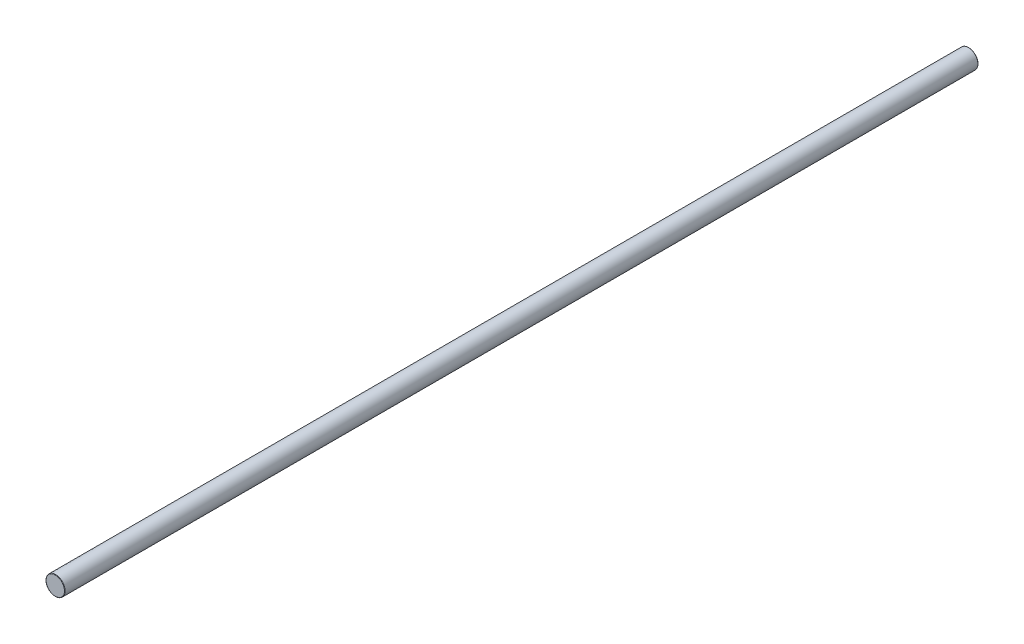
ISO-10303-21;
HEADER;
FILE_DESCRIPTION(('STEP AP214'),'2;1');
FILE_NAME('part.step','',(''),(''),'','','');
FILE_SCHEMA(('AUTOMOTIVE_DESIGN { 1 0 10303 214 1 1 1 1 }'));
ENDSEC;
DATA;
#1=APPLICATION_CONTEXT('core data for automotive mechanical design processes');
#2=APPLICATION_PROTOCOL_DEFINITION('international standard','automotive_design',2000,#1);
#3=PRODUCT_CONTEXT('',#1,'mechanical');
#4=PRODUCT('Part','Part','',(#3));
#5=PRODUCT_RELATED_PRODUCT_CATEGORY('part','',(#4));
#6=PRODUCT_DEFINITION_FORMATION('','',#4);
#7=PRODUCT_DEFINITION_CONTEXT('part definition',#1,'design');
#8=PRODUCT_DEFINITION('design','',#6,#7);
#9=PRODUCT_DEFINITION_SHAPE('','',#8);
#10=(LENGTH_UNIT() NAMED_UNIT(*) SI_UNIT(.MILLI.,.METRE.));
#11=(NAMED_UNIT(*) PLANE_ANGLE_UNIT() SI_UNIT($,.RADIAN.));
#12=(NAMED_UNIT(*) SI_UNIT($,.STERADIAN.) SOLID_ANGLE_UNIT());
#13=UNCERTAINTY_MEASURE_WITH_UNIT(LENGTH_MEASURE(1.E-05),#10,'distance_accuracy_value','');
#14=(GEOMETRIC_REPRESENTATION_CONTEXT(3) GLOBAL_UNCERTAINTY_ASSIGNED_CONTEXT((#13)) GLOBAL_UNIT_ASSIGNED_CONTEXT((#10,
#11,#12)) REPRESENTATION_CONTEXT('',''));
#15=CARTESIAN_POINT('',(0.,0.,0.));
#16=DIRECTION('',(0.,0.,1.));
#17=DIRECTION('',(1.,0.,0.));
#18=AXIS2_PLACEMENT_3D('',#15,#16,#17);
#19=CARTESIAN_POINT('',(0.,0.,609.6));
#20=DIRECTION('',(0.,0.,-1.));
#21=DIRECTION('',(-1.,0.,0.));
#22=AXIS2_PLACEMENT_3D('',#19,#20,#21);
#23=CYLINDRICAL_SURFACE('',#22,6.35);
#24=CARTESIAN_POINT('',(0.,0.,0.249999999999972));
#25=DIRECTION('',(0.,0.,1.));
#26=DIRECTION('',(1.,0.,0.));
#27=AXIS2_PLACEMENT_3D('',#24,#25,#26);
#28=CIRCLE('',#27,6.35);
#29=CARTESIAN_POINT('',(-6.35,0.,0.249999999999861));
#30=VERTEX_POINT('',#29);
#31=EDGE_CURVE('E48',#30,#30,#28,.T.);
#32=CARTESIAN_POINT('',(0.,0.,609.35));
#33=DIRECTION('',(0.,0.,1.));
#34=DIRECTION('',(1.,0.,0.));
#35=AXIS2_PLACEMENT_3D('',#32,#33,#34);
#36=CIRCLE('',#35,6.35);
#37=CARTESIAN_POINT('',(-6.35,0.,609.35));
#38=VERTEX_POINT('',#37);
#39=EDGE_CURVE('E52',#38,#38,#36,.F.);
#40=CARTESIAN_POINT('',(-6.35,0.,0.249999999999861));
#41=CARTESIAN_POINT('',(-6.35,0.,6.59479166666655));
#42=CARTESIAN_POINT('',(-6.35,0.,12.9395833333332));
#43=CARTESIAN_POINT('',(-6.35,0.,25.6291666666666));
#44=CARTESIAN_POINT('',(-6.35,0.,31.9739583333332));
#45=CARTESIAN_POINT('',(-6.35,0.,44.6635416666665));
#46=CARTESIAN_POINT('',(-6.35,0.,51.0083333333332));
#47=CARTESIAN_POINT('',(-6.35,0.,63.6979166666665));
#48=CARTESIAN_POINT('',(-6.35,0.,70.0427083333332));
#49=CARTESIAN_POINT('',(-6.35,0.,82.7322916666665));
#50=CARTESIAN_POINT('',(-6.35,0.,89.0770833333332));
#51=CARTESIAN_POINT('',(-6.35,0.,101.766666666667));
#52=CARTESIAN_POINT('',(-6.35,0.,108.111458333333));
#53=CARTESIAN_POINT('',(-6.35,0.,120.801041666667));
#54=CARTESIAN_POINT('',(-6.35,0.,127.145833333333));
#55=CARTESIAN_POINT('',(-6.35,0.,139.835416666667));
#56=CARTESIAN_POINT('',(-6.35,0.,146.180208333333));
#57=CARTESIAN_POINT('',(-6.35,0.,158.869791666667));
#58=CARTESIAN_POINT('',(-6.35,0.,165.214583333333));
#59=CARTESIAN_POINT('',(-6.35,0.,177.904166666666));
#60=CARTESIAN_POINT('',(-6.35,0.,184.248958333333));
#61=CARTESIAN_POINT('',(-6.35,0.,196.938541666667));
#62=CARTESIAN_POINT('',(-6.35,0.,203.283333333333));
#63=CARTESIAN_POINT('',(-6.35,0.,215.972916666667));
#64=CARTESIAN_POINT('',(-6.35,0.,222.317708333333));
#65=CARTESIAN_POINT('',(-6.35,0.,235.007291666667));
#66=CARTESIAN_POINT('',(-6.35,0.,241.352083333333));
#67=CARTESIAN_POINT('',(-6.35,0.,254.041666666667));
#68=CARTESIAN_POINT('',(-6.35,0.,260.386458333333));
#69=CARTESIAN_POINT('',(-6.35,0.,273.076041666667));
#70=CARTESIAN_POINT('',(-6.35,0.,279.420833333333));
#71=CARTESIAN_POINT('',(-6.35,0.,292.110416666667));
#72=CARTESIAN_POINT('',(-6.35,0.,298.455208333333));
#73=CARTESIAN_POINT('',(-6.35,0.,311.144791666667));
#74=CARTESIAN_POINT('',(-6.35,0.,317.489583333333));
#75=CARTESIAN_POINT('',(-6.35,0.,330.179166666667));
#76=CARTESIAN_POINT('',(-6.35,0.,336.523958333333));
#77=CARTESIAN_POINT('',(-6.35,0.,349.213541666667));
#78=CARTESIAN_POINT('',(-6.35,0.,355.558333333333));
#79=CARTESIAN_POINT('',(-6.35,0.,368.247916666667));
#80=CARTESIAN_POINT('',(-6.35,0.,374.592708333333));
#81=CARTESIAN_POINT('',(-6.35,0.,387.282291666667));
#82=CARTESIAN_POINT('',(-6.35,0.,393.627083333333));
#83=CARTESIAN_POINT('',(-6.35,0.,406.316666666667));
#84=CARTESIAN_POINT('',(-6.35,0.,412.661458333333));
#85=CARTESIAN_POINT('',(-6.35,0.,425.351041666667));
#86=CARTESIAN_POINT('',(-6.35,0.,431.695833333333));
#87=CARTESIAN_POINT('',(-6.35,0.,444.385416666667));
#88=CARTESIAN_POINT('',(-6.35,0.,450.730208333333));
#89=CARTESIAN_POINT('',(-6.35,0.,463.419791666667));
#90=CARTESIAN_POINT('',(-6.35,0.,469.764583333333));
#91=CARTESIAN_POINT('',(-6.35,0.,482.454166666667));
#92=CARTESIAN_POINT('',(-6.35,0.,488.798958333333));
#93=CARTESIAN_POINT('',(-6.35,0.,501.488541666667));
#94=CARTESIAN_POINT('',(-6.35,0.,507.833333333333));
#95=CARTESIAN_POINT('',(-6.35,0.,520.522916666667));
#96=CARTESIAN_POINT('',(-6.35,0.,526.867708333333));
#97=CARTESIAN_POINT('',(-6.35,0.,539.557291666667));
#98=CARTESIAN_POINT('',(-6.35,0.,545.902083333333));
#99=CARTESIAN_POINT('',(-6.35,0.,558.591666666667));
#100=CARTESIAN_POINT('',(-6.35,0.,564.936458333333));
#101=CARTESIAN_POINT('',(-6.35,0.,577.626041666667));
#102=CARTESIAN_POINT('',(-6.35,0.,583.970833333333));
#103=CARTESIAN_POINT('',(-6.35,0.,596.660416666667));
#104=CARTESIAN_POINT('',(-6.35,0.,603.005208333333));
#105=CARTESIAN_POINT('',(-6.35,0.,609.35));
#106=B_SPLINE_CURVE_WITH_KNOTS('',3,(#40,#41,#42,#43,#44,#45,#46,#47,#48,#49,#50,#51,#52,#53,
#54,#55,#56,#57,#58,#59,#60,#61,#62,#63,#64,#65,#66,#67,#68,#69,#70,#71,#72,#73,#74,#75,#76,#77,
#78,#79,#80,#81,#82,#83,#84,#85,#86,#87,#88,#89,#90,#91,#92,#93,#94,#95,#96,#97,#98,#99,#100,
#101,#102,#103,#104,#105),.UNSPECIFIED.,.F.,.F.,(4,2,2,2,2,2,2,2,2,2,2,2,2,2,2,2,2,2,2,2,2,2,2,
2,2,2,2,2,2,2,2,2,4),(0.,19.034375,38.06875,57.103125,76.1375,95.171875,114.20625,133.240625,
152.275,171.309375,190.34375,209.378125,228.4125,247.446875,266.48125,285.515625,304.55,
323.584375,342.61875,361.653125,380.6875,399.721875,418.75625,437.790625,456.825,475.859375,
494.89375,513.928125,532.9625,551.996875,571.03125,590.065625,609.1),.UNSPECIFIED.);
#107=EDGE_CURVE('BSEAM37',#30,#38,#106,.T.);
#108=ORIENTED_EDGE('',*,*,#31,.T.);
#109=ORIENTED_EDGE('',*,*,#39,.T.);
#110=ORIENTED_EDGE('',*,*,#107,.T.);
#111=ORIENTED_EDGE('',*,*,#107,.F.);
#112=EDGE_LOOP('',(#108,#110,#109,#111));
#113=FACE_BOUND('',#112,.T.);
#114=ADVANCED_FACE('F37',(#113),#23,.T.);
#115=CARTESIAN_POINT('',(0.,0.,609.6));
#116=DIRECTION('',(0.,0.,1.));
#117=DIRECTION('',(1.,0.,0.));
#118=AXIS2_PLACEMENT_3D('',#115,#116,#117);
#119=PLANE('',#118);
#120=CARTESIAN_POINT('',(0.,0.,609.6));
#121=DIRECTION('',(0.,0.,1.));
#122=DIRECTION('',(1.,0.,0.));
#123=AXIS2_PLACEMENT_3D('',#120,#121,#122);
#124=CIRCLE('',#123,6.1);
#125=CARTESIAN_POINT('',(6.1,0.,609.6));
#126=VERTEX_POINT('',#125);
#127=EDGE_CURVE('E10',#126,#126,#124,.T.);
#128=ORIENTED_EDGE('',*,*,#127,.T.);
#129=EDGE_LOOP('',(#128));
#130=FACE_BOUND('',#129,.T.);
#131=ADVANCED_FACE('F68',(#130),#119,.T.);
#132=CARTESIAN_POINT('',(0.,0.,0.));
#133=DIRECTION('',(0.,0.,1.));
#134=DIRECTION('',(1.,0.,0.));
#135=AXIS2_PLACEMENT_3D('',#132,#133,#134);
#136=PLANE('',#135);
#137=CARTESIAN_POINT('',(0.,0.,0.));
#138=DIRECTION('',(0.,0.,1.));
#139=DIRECTION('',(1.,0.,0.));
#140=AXIS2_PLACEMENT_3D('',#137,#138,#139);
#141=CIRCLE('',#140,6.1);
#142=CARTESIAN_POINT('',(6.1,0.,0.));
#143=VERTEX_POINT('',#142);
#144=EDGE_CURVE('E44',#143,#143,#141,.F.);
#145=ORIENTED_EDGE('',*,*,#144,.T.);
#146=EDGE_LOOP('',(#145));
#147=FACE_BOUND('',#146,.T.);
#148=ADVANCED_FACE('F65',(#147),#136,.F.);
#149=CARTESIAN_POINT('',(0.,0.,0.249999999999972));
#150=DIRECTION('',(0.,0.,1.));
#151=DIRECTION('',(1.,0.,0.));
#152=AXIS2_PLACEMENT_3D('',#149,#150,#151);
#153=TOROIDAL_SURFACE('',#152,6.1,0.25);
#154=ORIENTED_EDGE('',*,*,#144,.F.);
#155=EDGE_LOOP('',(#154));
#156=FACE_BOUND('',#155,.T.);
#157=ORIENTED_EDGE('',*,*,#31,.F.);
#158=EDGE_LOOP('',(#157));
#159=FACE_BOUND('',#158,.T.);
#160=ADVANCED_FACE('F61',(#156,#159),#153,.T.);
#161=CARTESIAN_POINT('',(0.,0.,609.35));
#162=DIRECTION('',(0.,0.,1.));
#163=DIRECTION('',(1.,0.,0.));
#164=AXIS2_PLACEMENT_3D('',#161,#162,#163);
#165=TOROIDAL_SURFACE('',#164,6.1,0.25);
#166=ORIENTED_EDGE('',*,*,#39,.F.);
#167=EDGE_LOOP('',(#166));
#168=FACE_BOUND('',#167,.T.);
#169=ORIENTED_EDGE('',*,*,#127,.F.);
#170=EDGE_LOOP('',(#169));
#171=FACE_BOUND('',#170,.T.);
#172=ADVANCED_FACE('F39',(#168,#171),#165,.T.);
#173=CLOSED_SHELL('',(#114,#131,#148,#160,#172));
#174=MANIFOLD_SOLID_BREP('B2',#173);
#175=ADVANCED_BREP_SHAPE_REPRESENTATION('',(#18,#174),#14);
#176=SHAPE_DEFINITION_REPRESENTATION(#9,#175);
ENDSEC;
END-ISO-10303-21;
